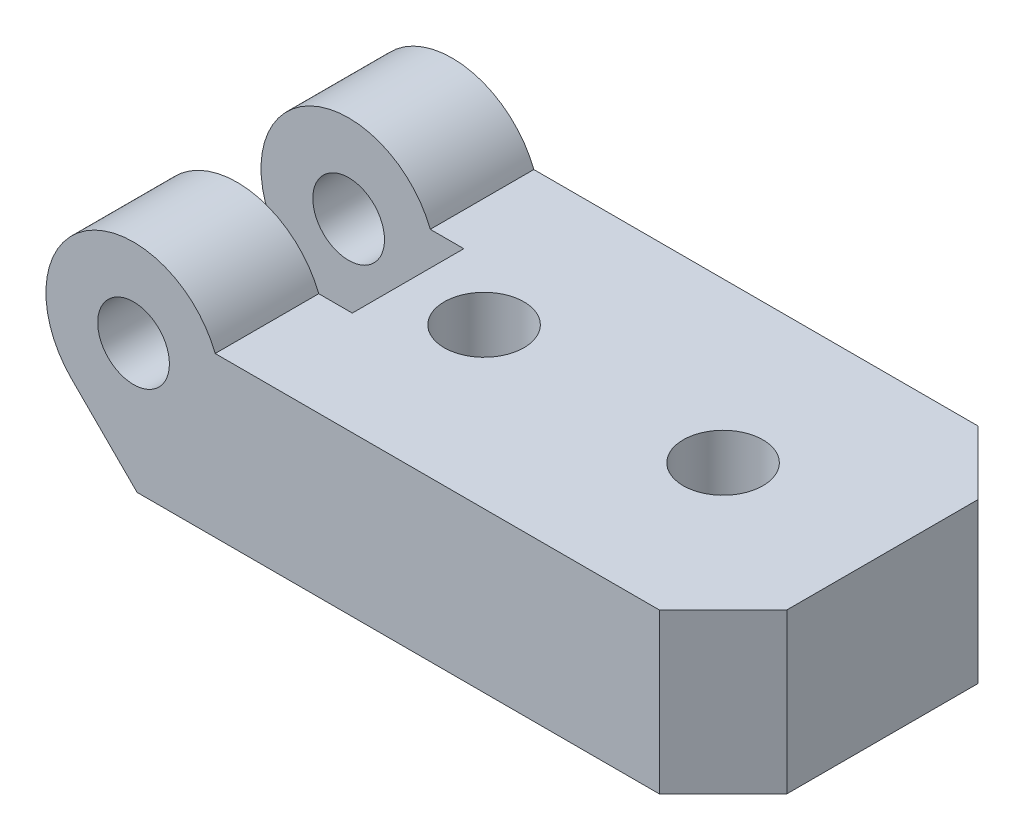
ISO-10303-21;
HEADER;
FILE_DESCRIPTION(('STEP AP214'),'2;1');
FILE_NAME('part.step','',(''),(''),'','','');
FILE_SCHEMA(('AUTOMOTIVE_DESIGN { 1 0 10303 214 1 1 1 1 }'));
ENDSEC;
DATA;
#1=APPLICATION_CONTEXT('core data for automotive mechanical design processes');
#2=APPLICATION_PROTOCOL_DEFINITION('international standard','automotive_design',2000,#1);
#3=PRODUCT_CONTEXT('',#1,'mechanical');
#4=PRODUCT('Part','Part','',(#3));
#5=PRODUCT_RELATED_PRODUCT_CATEGORY('part','',(#4));
#6=PRODUCT_DEFINITION_FORMATION('','',#4);
#7=PRODUCT_DEFINITION_CONTEXT('part definition',#1,'design');
#8=PRODUCT_DEFINITION('design','',#6,#7);
#9=PRODUCT_DEFINITION_SHAPE('','',#8);
#10=(LENGTH_UNIT() NAMED_UNIT(*) SI_UNIT(.MILLI.,.METRE.));
#11=(NAMED_UNIT(*) PLANE_ANGLE_UNIT() SI_UNIT($,.RADIAN.));
#12=(NAMED_UNIT(*) SI_UNIT($,.STERADIAN.) SOLID_ANGLE_UNIT());
#13=UNCERTAINTY_MEASURE_WITH_UNIT(LENGTH_MEASURE(1.E-05),#10,'distance_accuracy_value','');
#14=(GEOMETRIC_REPRESENTATION_CONTEXT(3) GLOBAL_UNCERTAINTY_ASSIGNED_CONTEXT((#13)) GLOBAL_UNIT_ASSIGNED_CONTEXT((#10,
#11,#12)) REPRESENTATION_CONTEXT('',''));
#15=CARTESIAN_POINT('',(0.,0.,0.));
#16=DIRECTION('',(0.,0.,1.));
#17=DIRECTION('',(1.,0.,0.));
#18=AXIS2_PLACEMENT_3D('',#15,#16,#17);
#19=CARTESIAN_POINT('',(0.,10.,0.));
#20=DIRECTION('',(0.,1.,0.));
#21=DIRECTION('',(0.,0.,1.));
#22=AXIS2_PLACEMENT_3D('',#19,#20,#21);
#23=PLANE('',#22);
#24=CARTESIAN_POINT('',(-10.,10.,0.));
#25=DIRECTION('',(0.,1.,0.));
#26=DIRECTION('',(0.,0.,1.));
#27=AXIS2_PLACEMENT_3D('',#24,#25,#26);
#28=CIRCLE('',#27,2.5);
#29=CARTESIAN_POINT('',(-10.,10.,2.5));
#30=VERTEX_POINT('',#29);
#31=EDGE_CURVE('E209',#30,#30,#28,.T.);
#32=ORIENTED_EDGE('',*,*,#31,.F.);
#33=EDGE_LOOP('',(#32));
#34=FACE_BOUND('',#33,.T.);
#35=CARTESIAN_POINT('',(-25.,10.,0.));
#36=DIRECTION('',(0.,1.,0.));
#37=DIRECTION('',(0.,0.,1.));
#38=AXIS2_PLACEMENT_3D('',#35,#36,#37);
#39=CIRCLE('',#38,2.5);
#40=CARTESIAN_POINT('',(-25.,10.,2.5));
#41=VERTEX_POINT('',#40);
#42=EDGE_CURVE('E203',#41,#41,#39,.T.);
#43=ORIENTED_EDGE('',*,*,#42,.F.);
#44=EDGE_LOOP('',(#43));
#45=FACE_BOUND('',#44,.T.);
#46=DIRECTION('',(0.,0.,-1.));
#47=VECTOR('',#46,1.);
#48=CARTESIAN_POINT('',(0.,10.,-10.));
#49=LINE('',#48,#47);
#50=CARTESIAN_POINT('',(0.,10.,6.));
#51=VERTEX_POINT('',#50);
#52=CARTESIAN_POINT('',(0.,10.,-5.99999999999998));
#53=VERTEX_POINT('',#52);
#54=EDGE_CURVE('E217',#51,#53,#49,.T.);
#55=ORIENTED_EDGE('',*,*,#54,.T.);
#56=DIRECTION('',(0.707106781186546,0.,0.707106781186549));
#57=VECTOR('',#56,1.);
#58=CARTESIAN_POINT('',(2.99999999999999,10.,-2.99999999999998));
#59=LINE('',#58,#57);
#60=CARTESIAN_POINT('',(-4.,10.,-10.));
#61=VERTEX_POINT('',#60);
#62=EDGE_CURVE('E44',#53,#61,#59,.F.);
#63=ORIENTED_EDGE('',*,*,#62,.T.);
#64=DIRECTION('',(-1.,0.,0.));
#65=VECTOR('',#64,1.);
#66=CARTESIAN_POINT('',(-35.,10.,-10.));
#67=LINE('',#66,#65);
#68=CARTESIAN_POINT('',(-31.8765246170202,10.,-10.));
#69=VERTEX_POINT('',#68);
#70=EDGE_CURVE('E220',#61,#69,#67,.T.);
#71=ORIENTED_EDGE('',*,*,#70,.T.);
#72=DIRECTION('',(0.,0.,-1.));
#73=VECTOR('',#72,1.);
#74=CARTESIAN_POINT('',(-31.8765246170202,10.,17.414074767268));
#75=LINE('',#74,#73);
#76=CARTESIAN_POINT('',(-31.8765246170202,10.,-3.5));
#77=VERTEX_POINT('',#76);
#78=EDGE_CURVE('E155',#69,#77,#75,.F.);
#79=ORIENTED_EDGE('',*,*,#78,.T.);
#80=DIRECTION('',(1.,0.,0.));
#81=VECTOR('',#80,1.);
#82=CARTESIAN_POINT('',(0.,10.,-3.5));
#83=LINE('',#82,#81);
#84=CARTESIAN_POINT('',(-29.7715838525995,10.,-3.5));
#85=VERTEX_POINT('',#84);
#86=EDGE_CURVE('E148',#77,#85,#83,.T.);
#87=ORIENTED_EDGE('',*,*,#86,.T.);
#88=DIRECTION('',(0.,0.,-1.));
#89=VECTOR('',#88,1.);
#90=CARTESIAN_POINT('',(-29.7715838525995,10.,24.7132034355964));
#91=LINE('',#90,#89);
#92=CARTESIAN_POINT('',(-29.7715838525995,10.,3.5));
#93=VERTEX_POINT('',#92);
#94=EDGE_CURVE('E133',#85,#93,#91,.F.);
#95=ORIENTED_EDGE('',*,*,#94,.T.);
#96=DIRECTION('',(1.,0.,0.));
#97=VECTOR('',#96,1.);
#98=CARTESIAN_POINT('',(0.,10.,3.5));
#99=LINE('',#98,#97);
#100=CARTESIAN_POINT('',(-31.8765246170202,10.,3.5));
#101=VERTEX_POINT('',#100);
#102=EDGE_CURVE('E142',#101,#93,#99,.T.);
#103=ORIENTED_EDGE('',*,*,#102,.F.);
#104=DIRECTION('',(0.,0.,1.));
#105=VECTOR('',#104,1.);
#106=CARTESIAN_POINT('',(-31.8765246170202,10.,-17.414074767268));
#107=LINE('',#106,#105);
#108=CARTESIAN_POINT('',(-31.8765246170202,10.,10.));
#109=VERTEX_POINT('',#108);
#110=EDGE_CURVE('E199',#109,#101,#107,.F.);
#111=ORIENTED_EDGE('',*,*,#110,.F.);
#112=DIRECTION('',(1.,0.,0.));
#113=VECTOR('',#112,1.);
#114=CARTESIAN_POINT('',(-35.,10.,10.));
#115=LINE('',#114,#113);
#116=CARTESIAN_POINT('',(-4.,10.,10.));
#117=VERTEX_POINT('',#116);
#118=EDGE_CURVE('E215',#109,#117,#115,.T.);
#119=ORIENTED_EDGE('',*,*,#118,.T.);
#120=DIRECTION('',(-0.707106781186549,0.,0.707106781186546));
#121=VECTOR('',#120,1.);
#122=CARTESIAN_POINT('',(3.,10.,3.00000000000001));
#123=LINE('',#122,#121);
#124=EDGE_CURVE('E246',#117,#51,#123,.F.);
#125=ORIENTED_EDGE('',*,*,#124,.T.);
#126=EDGE_LOOP('',(#55,#63,#71,#79,#87,#95,#103,#111,#119,#125));
#127=FACE_BOUND('',#126,.T.);
#128=ADVANCED_FACE('F36',(#34,#45,#127),#23,.T.);
#129=CARTESIAN_POINT('',(-35.,10.,-10.));
#130=DIRECTION('',(1.,0.,0.));
#131=DIRECTION('',(0.,0.,-1.));
#132=AXIS2_PLACEMENT_3D('',#129,#130,#131);
#133=PLANE('',#132);
#134=DIRECTION('',(0.,0.,-1.));
#135=VECTOR('',#134,1.);
#136=CARTESIAN_POINT('',(-35.,0.771583852599522,24.7132034355964));
#137=LINE('',#136,#135);
#138=CARTESIAN_POINT('',(-35.,0.771583852599522,-3.5));
#139=VERTEX_POINT('',#138);
#140=CARTESIAN_POINT('',(-35.,0.771583852599522,3.5));
#141=VERTEX_POINT('',#140);
#142=EDGE_CURVE('E143',#139,#141,#137,.F.);
#143=ORIENTED_EDGE('',*,*,#142,.F.);
#144=DIRECTION('',(0.,1.,0.));
#145=VECTOR('',#144,1.);
#146=CARTESIAN_POINT('',(-35.,0.,-3.5));
#147=LINE('',#146,#145);
#148=CARTESIAN_POINT('',(-35.,0.,-3.5));
#149=VERTEX_POINT('',#148);
#150=EDGE_CURVE('E151',#149,#139,#147,.T.);
#151=ORIENTED_EDGE('',*,*,#150,.F.);
#152=DIRECTION('',(0.,0.,1.));
#153=VECTOR('',#152,1.);
#154=CARTESIAN_POINT('',(-35.,0.,-10.));
#155=LINE('',#154,#153);
#156=CARTESIAN_POINT('',(-35.,0.,3.5));
#157=VERTEX_POINT('',#156);
#158=EDGE_CURVE('E212',#149,#157,#155,.T.);
#159=ORIENTED_EDGE('',*,*,#158,.T.);
#160=DIRECTION('',(0.,-1.,0.));
#161=VECTOR('',#160,1.);
#162=CARTESIAN_POINT('',(-35.,10.,3.5));
#163=LINE('',#162,#161);
#164=EDGE_CURVE('E222',#141,#157,#163,.T.);
#165=ORIENTED_EDGE('',*,*,#164,.F.);
#166=EDGE_LOOP('',(#143,#151,#159,#165));
#167=FACE_BOUND('',#166,.T.);
#168=ADVANCED_FACE('F280',(#167),#133,.F.);
#169=CARTESIAN_POINT('',(0.,0.,0.));
#170=DIRECTION('',(0.,1.,0.));
#171=DIRECTION('',(0.,0.,1.));
#172=AXIS2_PLACEMENT_3D('',#169,#170,#171);
#173=PLANE('',#172);
#174=CARTESIAN_POINT('',(-10.,0.,0.));
#175=DIRECTION('',(0.,1.,0.));
#176=DIRECTION('',(0.,0.,1.));
#177=AXIS2_PLACEMENT_3D('',#174,#175,#176);
#178=CIRCLE('',#177,2.5);
#179=CARTESIAN_POINT('',(-10.,0.,2.5));
#180=VERTEX_POINT('',#179);
#181=EDGE_CURVE('E206',#180,#180,#178,.T.);
#182=ORIENTED_EDGE('',*,*,#181,.T.);
#183=EDGE_LOOP('',(#182));
#184=FACE_BOUND('',#183,.T.);
#185=DIRECTION('',(-1.,0.,0.));
#186=VECTOR('',#185,1.);
#187=CARTESIAN_POINT('',(-35.,0.,-10.));
#188=LINE('',#187,#186);
#189=CARTESIAN_POINT('',(-4.,0.,-10.));
#190=VERTEX_POINT('',#189);
#191=CARTESIAN_POINT('',(-36.778174593052,0.,-10.));
#192=VERTEX_POINT('',#191);
#193=EDGE_CURVE('E218',#190,#192,#188,.T.);
#194=ORIENTED_EDGE('',*,*,#193,.F.);
#195=DIRECTION('',(-0.707106781186546,0.,-0.707106781186549));
#196=VECTOR('',#195,1.);
#197=CARTESIAN_POINT('',(-4.,0.,-10.));
#198=LINE('',#197,#196);
#199=CARTESIAN_POINT('',(0.,0.,-5.99999999999998));
#200=VERTEX_POINT('',#199);
#201=EDGE_CURVE('E240',#190,#200,#198,.F.);
#202=ORIENTED_EDGE('',*,*,#201,.T.);
#203=DIRECTION('',(0.,0.,-1.));
#204=VECTOR('',#203,1.);
#205=CARTESIAN_POINT('',(0.,0.,-10.));
#206=LINE('',#205,#204);
#207=CARTESIAN_POINT('',(0.,0.,6.));
#208=VERTEX_POINT('',#207);
#209=EDGE_CURVE('E227',#208,#200,#206,.T.);
#210=ORIENTED_EDGE('',*,*,#209,.F.);
#211=DIRECTION('',(0.707106781186549,0.,-0.707106781186546));
#212=VECTOR('',#211,1.);
#213=CARTESIAN_POINT('',(0.,0.,6.));
#214=LINE('',#213,#212);
#215=CARTESIAN_POINT('',(-4.00000000000001,0.,10.));
#216=VERTEX_POINT('',#215);
#217=EDGE_CURVE('E238',#208,#216,#214,.F.);
#218=ORIENTED_EDGE('',*,*,#217,.T.);
#219=DIRECTION('',(1.,0.,0.));
#220=VECTOR('',#219,1.);
#221=CARTESIAN_POINT('',(-35.,0.,10.));
#222=LINE('',#221,#220);
#223=CARTESIAN_POINT('',(-36.778174593052,0.,10.));
#224=VERTEX_POINT('',#223);
#225=EDGE_CURVE('E225',#224,#216,#222,.T.);
#226=ORIENTED_EDGE('',*,*,#225,.F.);
#227=DIRECTION('',(0.,0.,1.));
#228=VECTOR('',#227,1.);
#229=CARTESIAN_POINT('',(-36.778174593052,0.,-17.414074767268));
#230=LINE('',#229,#228);
#231=CARTESIAN_POINT('',(-36.778174593052,0.,3.5));
#232=VERTEX_POINT('',#231);
#233=EDGE_CURVE('E185',#232,#224,#230,.T.);
#234=ORIENTED_EDGE('',*,*,#233,.F.);
#235=DIRECTION('',(-1.,0.,0.));
#236=VECTOR('',#235,1.);
#237=CARTESIAN_POINT('',(-35.,0.,3.5));
#238=LINE('',#237,#236);
#239=EDGE_CURVE('E182',#157,#232,#238,.T.);
#240=ORIENTED_EDGE('',*,*,#239,.F.);
#241=ORIENTED_EDGE('',*,*,#158,.F.);
#242=DIRECTION('',(1.,0.,0.));
#243=VECTOR('',#242,1.);
#244=CARTESIAN_POINT('',(-35.,0.,-3.5));
#245=LINE('',#244,#243);
#246=CARTESIAN_POINT('',(-36.778174593052,0.,-3.5));
#247=VERTEX_POINT('',#246);
#248=EDGE_CURVE('E169',#247,#149,#245,.T.);
#249=ORIENTED_EDGE('',*,*,#248,.F.);
#250=DIRECTION('',(0.,0.,-1.));
#251=VECTOR('',#250,1.);
#252=CARTESIAN_POINT('',(-36.778174593052,0.,17.414074767268));
#253=LINE('',#252,#251);
#254=EDGE_CURVE('E166',#247,#192,#253,.T.);
#255=ORIENTED_EDGE('',*,*,#254,.T.);
#256=EDGE_LOOP('',(#194,#202,#210,#218,#226,#234,#240,#241,#249,#255));
#257=FACE_BOUND('',#256,.T.);
#258=CARTESIAN_POINT('',(-25.,0.,0.));
#259=DIRECTION('',(0.,1.,0.));
#260=DIRECTION('',(0.,0.,1.));
#261=AXIS2_PLACEMENT_3D('',#258,#259,#260);
#262=CIRCLE('',#261,2.5);
#263=CARTESIAN_POINT('',(-25.,0.,2.5));
#264=VERTEX_POINT('',#263);
#265=EDGE_CURVE('E202',#264,#264,#262,.T.);
#266=ORIENTED_EDGE('',*,*,#265,.T.);
#267=EDGE_LOOP('',(#266));
#268=FACE_BOUND('',#267,.T.);
#269=ADVANCED_FACE('F259',(#184,#257,#268),#173,.F.);
#270=CARTESIAN_POINT('',(-35.,10.,10.));
#271=DIRECTION('',(0.,0.,-1.));
#272=DIRECTION('',(-1.,0.,0.));
#273=AXIS2_PLACEMENT_3D('',#270,#271,#272);
#274=PLANE('',#273);
#275=CARTESIAN_POINT('',(-37.,8.,10.));
#276=DIRECTION('',(0.,0.,1.));
#277=DIRECTION('',(1.,0.,0.));
#278=AXIS2_PLACEMENT_3D('',#275,#276,#277);
#279=CIRCLE('',#278,2.25);
#280=CARTESIAN_POINT('',(-34.75,8.,10.));
#281=VERTEX_POINT('',#280);
#282=EDGE_CURVE('E349',#281,#281,#279,.T.);
#283=ORIENTED_EDGE('',*,*,#282,.F.);
#284=EDGE_LOOP('',(#283));
#285=FACE_BOUND('',#284,.T.);
#286=ORIENTED_EDGE('',*,*,#225,.T.);
#287=DIRECTION('',(0.,1.,0.));
#288=VECTOR('',#287,1.);
#289=CARTESIAN_POINT('',(-4.00000000000001,10.,10.));
#290=LINE('',#289,#288);
#291=EDGE_CURVE('E12',#216,#117,#290,.T.);
#292=ORIENTED_EDGE('',*,*,#291,.T.);
#293=ORIENTED_EDGE('',*,*,#118,.F.);
#294=CARTESIAN_POINT('',(-37.,8.,10.));
#295=DIRECTION('',(0.,0.,1.));
#296=DIRECTION('',(1.,0.,0.));
#297=AXIS2_PLACEMENT_3D('',#294,#295,#296);
#298=CIRCLE('',#297,5.5);
#299=CARTESIAN_POINT('',(-40.889087296526,4.11091270347399,10.));
#300=VERTEX_POINT('',#299);
#301=EDGE_CURVE('E181',#109,#300,#298,.T.);
#302=ORIENTED_EDGE('',*,*,#301,.T.);
#303=DIRECTION('',(0.707106781186546,-0.707106781186549,0.));
#304=VECTOR('',#303,1.);
#305=CARTESIAN_POINT('',(-36.778174593052,0.,10.));
#306=LINE('',#305,#304);
#307=EDGE_CURVE('E190',#300,#224,#306,.T.);
#308=ORIENTED_EDGE('',*,*,#307,.T.);
#309=EDGE_LOOP('',(#286,#292,#293,#302,#308));
#310=FACE_BOUND('',#309,.T.);
#311=ADVANCED_FACE('F266',(#285,#310),#274,.F.);
#312=CARTESIAN_POINT('',(0.,10.,-10.));
#313=DIRECTION('',(-1.,0.,0.));
#314=DIRECTION('',(0.,0.,1.));
#315=AXIS2_PLACEMENT_3D('',#312,#313,#314);
#316=PLANE('',#315);
#317=ORIENTED_EDGE('',*,*,#209,.T.);
#318=DIRECTION('',(0.,1.,0.));
#319=VECTOR('',#318,1.);
#320=CARTESIAN_POINT('',(0.,10.,-5.99999999999998));
#321=LINE('',#320,#319);
#322=EDGE_CURVE('E57',#200,#53,#321,.T.);
#323=ORIENTED_EDGE('',*,*,#322,.T.);
#324=ORIENTED_EDGE('',*,*,#54,.F.);
#325=DIRECTION('',(0.,-1.,0.));
#326=VECTOR('',#325,1.);
#327=CARTESIAN_POINT('',(0.,10.,6.));
#328=LINE('',#327,#326);
#329=EDGE_CURVE('E242',#51,#208,#328,.T.);
#330=ORIENTED_EDGE('',*,*,#329,.T.);
#331=EDGE_LOOP('',(#317,#323,#324,#330));
#332=FACE_BOUND('',#331,.T.);
#333=ADVANCED_FACE('F261',(#332),#316,.F.);
#334=CARTESIAN_POINT('',(-35.,10.,-10.));
#335=DIRECTION('',(0.,0.,1.));
#336=DIRECTION('',(1.,0.,0.));
#337=AXIS2_PLACEMENT_3D('',#334,#335,#336);
#338=PLANE('',#337);
#339=CARTESIAN_POINT('',(-37.,8.,-10.));
#340=DIRECTION('',(0.,0.,1.));
#341=DIRECTION('',(1.,0.,0.));
#342=AXIS2_PLACEMENT_3D('',#339,#340,#341);
#343=CIRCLE('',#342,2.25);
#344=CARTESIAN_POINT('',(-34.75,8.,-10.));
#345=VERTEX_POINT('',#344);
#346=EDGE_CURVE('E235',#345,#345,#343,.T.);
#347=ORIENTED_EDGE('',*,*,#346,.T.);
#348=EDGE_LOOP('',(#347));
#349=FACE_BOUND('',#348,.T.);
#350=ORIENTED_EDGE('',*,*,#70,.F.);
#351=DIRECTION('',(0.,-1.,0.));
#352=VECTOR('',#351,1.);
#353=CARTESIAN_POINT('',(-4.,10.,-10.));
#354=LINE('',#353,#352);
#355=EDGE_CURVE('E231',#61,#190,#354,.T.);
#356=ORIENTED_EDGE('',*,*,#355,.T.);
#357=ORIENTED_EDGE('',*,*,#193,.T.);
#358=DIRECTION('',(0.707106781186546,-0.707106781186549,0.));
#359=VECTOR('',#358,1.);
#360=CARTESIAN_POINT('',(-36.778174593052,0.,-10.));
#361=LINE('',#360,#359);
#362=CARTESIAN_POINT('',(-40.889087296526,4.11091270347399,-10.));
#363=VERTEX_POINT('',#362);
#364=EDGE_CURVE('E163',#363,#192,#361,.T.);
#365=ORIENTED_EDGE('',*,*,#364,.F.);
#366=CARTESIAN_POINT('',(-37.,8.,-10.));
#367=DIRECTION('',(0.,0.,1.));
#368=DIRECTION('',(1.,0.,0.));
#369=AXIS2_PLACEMENT_3D('',#366,#367,#368);
#370=CIRCLE('',#369,5.5);
#371=EDGE_CURVE('E162',#69,#363,#370,.T.);
#372=ORIENTED_EDGE('',*,*,#371,.F.);
#373=EDGE_LOOP('',(#350,#356,#357,#365,#372));
#374=FACE_BOUND('',#373,.T.);
#375=ADVANCED_FACE('F253',(#349,#374),#338,.F.);
#376=CARTESIAN_POINT('',(-10.,10.,0.));
#377=DIRECTION('',(0.,-1.,0.));
#378=DIRECTION('',(0.,0.,-1.));
#379=AXIS2_PLACEMENT_3D('',#376,#377,#378);
#380=CYLINDRICAL_SURFACE('',#379,2.5);
#381=ORIENTED_EDGE('',*,*,#31,.T.);
#382=EDGE_LOOP('',(#381));
#383=FACE_BOUND('',#382,.T.);
#384=ORIENTED_EDGE('',*,*,#181,.F.);
#385=EDGE_LOOP('',(#384));
#386=FACE_BOUND('',#385,.T.);
#387=ADVANCED_FACE('F334',(#383,#386),#380,.F.);
#388=CARTESIAN_POINT('',(-25.,10.,0.));
#389=DIRECTION('',(0.,-1.,0.));
#390=DIRECTION('',(0.,0.,-1.));
#391=AXIS2_PLACEMENT_3D('',#388,#389,#390);
#392=CYLINDRICAL_SURFACE('',#391,2.5);
#393=ORIENTED_EDGE('',*,*,#42,.T.);
#394=EDGE_LOOP('',(#393));
#395=FACE_BOUND('',#394,.T.);
#396=ORIENTED_EDGE('',*,*,#265,.F.);
#397=EDGE_LOOP('',(#396));
#398=FACE_BOUND('',#397,.T.);
#399=ADVANCED_FACE('F330',(#395,#398),#392,.F.);
#400=CARTESIAN_POINT('',(-37.,8.,-17.414074767268));
#401=DIRECTION('',(0.,0.,1.));
#402=DIRECTION('',(1.,0.,0.));
#403=AXIS2_PLACEMENT_3D('',#400,#401,#402);
#404=CYLINDRICAL_SURFACE('',#403,5.5);
#405=ORIENTED_EDGE('',*,*,#301,.F.);
#406=ORIENTED_EDGE('',*,*,#110,.T.);
#407=CARTESIAN_POINT('',(-37.,8.,3.5));
#408=DIRECTION('',(0.,0.,1.));
#409=DIRECTION('',(1.,0.,0.));
#410=AXIS2_PLACEMENT_3D('',#407,#408,#409);
#411=CIRCLE('',#410,5.5);
#412=CARTESIAN_POINT('',(-40.889087296526,4.11091270347399,3.5));
#413=VERTEX_POINT('',#412);
#414=EDGE_CURVE('E184',#413,#101,#411,.F.);
#415=ORIENTED_EDGE('',*,*,#414,.F.);
#416=DIRECTION('',(0.,0.,1.));
#417=VECTOR('',#416,1.);
#418=CARTESIAN_POINT('',(-40.889087296526,4.11091270347399,-17.414074767268));
#419=LINE('',#418,#417);
#420=EDGE_CURVE('E193',#413,#300,#419,.T.);
#421=ORIENTED_EDGE('',*,*,#420,.T.);
#422=EDGE_LOOP('',(#405,#406,#415,#421));
#423=FACE_BOUND('',#422,.T.);
#424=ADVANCED_FACE('F327',(#423),#404,.T.);
#425=CARTESIAN_POINT('',(-36.778174593052,0.,-17.414074767268));
#426=DIRECTION('',(-0.707106781186549,-0.707106781186546,0.));
#427=DIRECTION('',(0.707106781186546,-0.707106781186549,0.));
#428=AXIS2_PLACEMENT_3D('',#425,#426,#427);
#429=PLANE('',#428);
#430=DIRECTION('',(-0.707106781186546,0.707106781186549,0.));
#431=VECTOR('',#430,1.);
#432=CARTESIAN_POINT('',(-36.778174593052,0.,3.5));
#433=LINE('',#432,#431);
#434=EDGE_CURVE('E188',#232,#413,#433,.T.);
#435=ORIENTED_EDGE('',*,*,#434,.F.);
#436=ORIENTED_EDGE('',*,*,#233,.T.);
#437=ORIENTED_EDGE('',*,*,#307,.F.);
#438=ORIENTED_EDGE('',*,*,#420,.F.);
#439=EDGE_LOOP('',(#435,#436,#437,#438));
#440=FACE_BOUND('',#439,.T.);
#441=ADVANCED_FACE('F271',(#440),#429,.T.);
#442=CARTESIAN_POINT('',(0.,0.,3.5));
#443=DIRECTION('',(0.,0.,1.));
#444=DIRECTION('',(1.,0.,0.));
#445=AXIS2_PLACEMENT_3D('',#442,#443,#444);
#446=PLANE('',#445);
#447=CARTESIAN_POINT('',(-37.,8.,3.5));
#448=DIRECTION('',(0.,0.,1.));
#449=DIRECTION('',(1.,0.,0.));
#450=AXIS2_PLACEMENT_3D('',#447,#448,#449);
#451=CIRCLE('',#450,2.25);
#452=CARTESIAN_POINT('',(-34.75,8.,3.5));
#453=VERTEX_POINT('',#452);
#454=EDGE_CURVE('E152',#453,#453,#451,.T.);
#455=ORIENTED_EDGE('',*,*,#454,.T.);
#456=EDGE_LOOP('',(#455));
#457=FACE_BOUND('',#456,.T.);
#458=ORIENTED_EDGE('',*,*,#414,.T.);
#459=ORIENTED_EDGE('',*,*,#102,.T.);
#460=CARTESIAN_POINT('',(-37.,8.,3.5));
#461=DIRECTION('',(0.,0.,1.));
#462=DIRECTION('',(1.,0.,0.));
#463=AXIS2_PLACEMENT_3D('',#460,#461,#462);
#464=CIRCLE('',#463,7.5);
#465=EDGE_CURVE('E139',#141,#93,#464,.T.);
#466=ORIENTED_EDGE('',*,*,#465,.F.);
#467=ORIENTED_EDGE('',*,*,#164,.T.);
#468=ORIENTED_EDGE('',*,*,#239,.T.);
#469=ORIENTED_EDGE('',*,*,#434,.T.);
#470=EDGE_LOOP('',(#458,#459,#466,#467,#468,#469));
#471=FACE_BOUND('',#470,.T.);
#472=ADVANCED_FACE('F276',(#457,#471),#446,.F.);
#473=CARTESIAN_POINT('',(0.,0.,-3.5));
#474=DIRECTION('',(0.,0.,1.));
#475=DIRECTION('',(1.,0.,0.));
#476=AXIS2_PLACEMENT_3D('',#473,#474,#475);
#477=PLANE('',#476);
#478=CARTESIAN_POINT('',(-37.,8.,-3.5));
#479=DIRECTION('',(0.,0.,1.));
#480=DIRECTION('',(1.,0.,0.));
#481=AXIS2_PLACEMENT_3D('',#478,#479,#480);
#482=CIRCLE('',#481,2.25);
#483=CARTESIAN_POINT('',(-34.75,8.,-3.5));
#484=VERTEX_POINT('',#483);
#485=EDGE_CURVE('E232',#484,#484,#482,.T.);
#486=ORIENTED_EDGE('',*,*,#485,.F.);
#487=EDGE_LOOP('',(#486));
#488=FACE_BOUND('',#487,.T.);
#489=ORIENTED_EDGE('',*,*,#86,.F.);
#490=CARTESIAN_POINT('',(-37.,8.,-3.5));
#491=DIRECTION('',(0.,0.,1.));
#492=DIRECTION('',(1.,0.,0.));
#493=AXIS2_PLACEMENT_3D('',#490,#491,#492);
#494=CIRCLE('',#493,5.5);
#495=CARTESIAN_POINT('',(-40.889087296526,4.11091270347399,-3.5));
#496=VERTEX_POINT('',#495);
#497=EDGE_CURVE('E173',#77,#496,#494,.T.);
#498=ORIENTED_EDGE('',*,*,#497,.T.);
#499=DIRECTION('',(0.707106781186546,-0.707106781186549,0.));
#500=VECTOR('',#499,1.);
#501=CARTESIAN_POINT('',(-36.778174593052,0.,-3.5));
#502=LINE('',#501,#500);
#503=EDGE_CURVE('E171',#496,#247,#502,.T.);
#504=ORIENTED_EDGE('',*,*,#503,.T.);
#505=ORIENTED_EDGE('',*,*,#248,.T.);
#506=ORIENTED_EDGE('',*,*,#150,.T.);
#507=CARTESIAN_POINT('',(-37.,8.,-3.5));
#508=DIRECTION('',(0.,0.,1.));
#509=DIRECTION('',(1.,0.,0.));
#510=AXIS2_PLACEMENT_3D('',#507,#508,#509);
#511=CIRCLE('',#510,7.5);
#512=EDGE_CURVE('E137',#139,#85,#511,.T.);
#513=ORIENTED_EDGE('',*,*,#512,.T.);
#514=EDGE_LOOP('',(#489,#498,#504,#505,#506,#513));
#515=FACE_BOUND('',#514,.T.);
#516=ADVANCED_FACE('F147',(#488,#515),#477,.T.);
#517=CARTESIAN_POINT('',(-37.,8.,17.414074767268));
#518=DIRECTION('',(0.,0.,-1.));
#519=DIRECTION('',(-1.,0.,0.));
#520=AXIS2_PLACEMENT_3D('',#517,#518,#519);
#521=CYLINDRICAL_SURFACE('',#520,5.5);
#522=ORIENTED_EDGE('',*,*,#78,.F.);
#523=ORIENTED_EDGE('',*,*,#371,.T.);
#524=DIRECTION('',(0.,0.,-1.));
#525=VECTOR('',#524,1.);
#526=CARTESIAN_POINT('',(-40.889087296526,4.11091270347399,17.414074767268));
#527=LINE('',#526,#525);
#528=EDGE_CURVE('E167',#496,#363,#527,.T.);
#529=ORIENTED_EDGE('',*,*,#528,.F.);
#530=ORIENTED_EDGE('',*,*,#497,.F.);
#531=EDGE_LOOP('',(#522,#523,#529,#530));
#532=FACE_BOUND('',#531,.T.);
#533=ADVANCED_FACE('F314',(#532),#521,.T.);
#534=CARTESIAN_POINT('',(-36.778174593052,0.,17.414074767268));
#535=DIRECTION('',(0.707106781186549,0.707106781186546,0.));
#536=DIRECTION('',(-0.707106781186546,0.707106781186549,0.));
#537=AXIS2_PLACEMENT_3D('',#534,#535,#536);
#538=PLANE('',#537);
#539=ORIENTED_EDGE('',*,*,#503,.F.);
#540=ORIENTED_EDGE('',*,*,#528,.T.);
#541=ORIENTED_EDGE('',*,*,#364,.T.);
#542=ORIENTED_EDGE('',*,*,#254,.F.);
#543=EDGE_LOOP('',(#539,#540,#541,#542));
#544=FACE_BOUND('',#543,.T.);
#545=ADVANCED_FACE('F311',(#544),#538,.F.);
#546=CARTESIAN_POINT('',(-37.,8.,24.7132034355964));
#547=DIRECTION('',(0.,0.,-1.));
#548=DIRECTION('',(-1.,0.,0.));
#549=AXIS2_PLACEMENT_3D('',#546,#547,#548);
#550=CYLINDRICAL_SURFACE('',#549,7.5);
#551=ORIENTED_EDGE('',*,*,#512,.F.);
#552=ORIENTED_EDGE('',*,*,#142,.T.);
#553=ORIENTED_EDGE('',*,*,#465,.T.);
#554=ORIENTED_EDGE('',*,*,#94,.F.);
#555=EDGE_LOOP('',(#551,#552,#553,#554));
#556=FACE_BOUND('',#555,.T.);
#557=ADVANCED_FACE('F135',(#556),#550,.F.);
#558=CARTESIAN_POINT('',(-37.,8.,-10.));
#559=DIRECTION('',(0.,0.,1.));
#560=DIRECTION('',(1.,0.,0.));
#561=AXIS2_PLACEMENT_3D('',#558,#559,#560);
#562=CYLINDRICAL_SURFACE('',#561,2.25);
#563=ORIENTED_EDGE('',*,*,#485,.T.);
#564=EDGE_LOOP('',(#563));
#565=FACE_BOUND('',#564,.T.);
#566=ORIENTED_EDGE('',*,*,#346,.F.);
#567=EDGE_LOOP('',(#566));
#568=FACE_BOUND('',#567,.T.);
#569=ADVANCED_FACE('F299',(#565,#568),#562,.F.);
#570=ORIENTED_EDGE('',*,*,#282,.T.);
#571=EDGE_LOOP('',(#570));
#572=FACE_BOUND('',#571,.T.);
#573=ORIENTED_EDGE('',*,*,#454,.F.);
#574=EDGE_LOOP('',(#573));
#575=FACE_BOUND('',#574,.T.);
#576=ADVANCED_FACE('F294',(#572,#575),#562,.F.);
#577=CARTESIAN_POINT('',(-4.,10.,-10.));
#578=DIRECTION('',(-0.707106781186549,0.,0.707106781186546));
#579=DIRECTION('',(0.,-1.,0.));
#580=AXIS2_PLACEMENT_3D('',#577,#578,#579);
#581=PLANE('',#580);
#582=ORIENTED_EDGE('',*,*,#62,.F.);
#583=ORIENTED_EDGE('',*,*,#322,.F.);
#584=ORIENTED_EDGE('',*,*,#201,.F.);
#585=ORIENTED_EDGE('',*,*,#355,.F.);
#586=EDGE_LOOP('',(#582,#583,#584,#585));
#587=FACE_BOUND('',#586,.T.);
#588=ADVANCED_FACE('F256',(#587),#581,.F.);
#589=CARTESIAN_POINT('',(0.,10.,6.));
#590=DIRECTION('',(-0.707106781186546,0.,-0.707106781186549));
#591=DIRECTION('',(0.,-1.,0.));
#592=AXIS2_PLACEMENT_3D('',#589,#590,#591);
#593=PLANE('',#592);
#594=ORIENTED_EDGE('',*,*,#124,.F.);
#595=ORIENTED_EDGE('',*,*,#291,.F.);
#596=ORIENTED_EDGE('',*,*,#217,.F.);
#597=ORIENTED_EDGE('',*,*,#329,.F.);
#598=EDGE_LOOP('',(#594,#595,#596,#597));
#599=FACE_BOUND('',#598,.T.);
#600=ADVANCED_FACE('F38',(#599),#593,.F.);
#601=CLOSED_SHELL('',(#128,#168,#269,#311,#333,#375,#387,#399,#424,#441,#472,#516,#533,#545,
#557,#569,#576,#588,#600));
#602=MANIFOLD_SOLID_BREP('B2',#601);
#603=ADVANCED_BREP_SHAPE_REPRESENTATION('',(#18,#602),#14);
#604=SHAPE_DEFINITION_REPRESENTATION(#9,#603);
ENDSEC;
END-ISO-10303-21;
